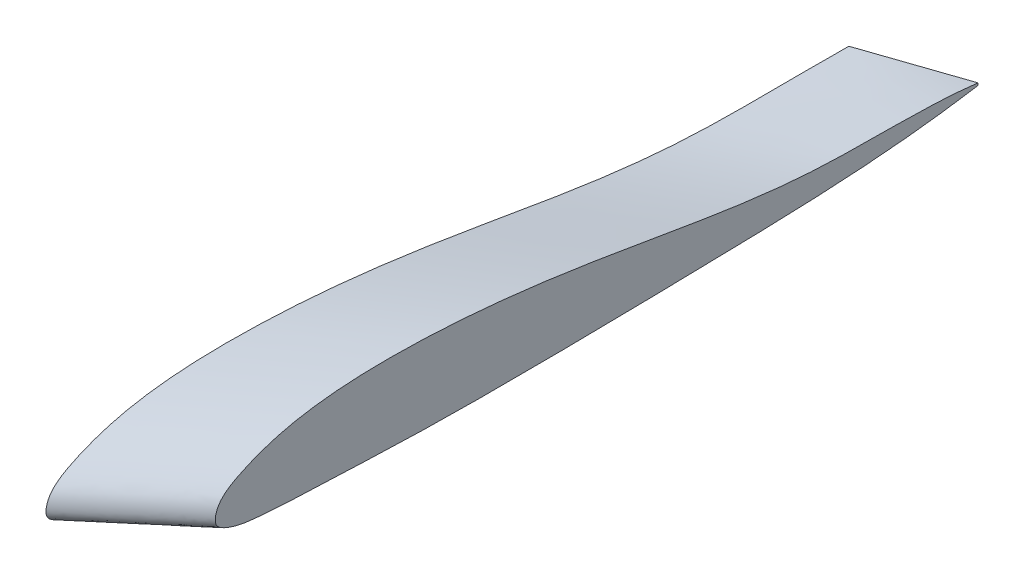
ISO-10303-21;
HEADER;
FILE_DESCRIPTION(('STEP AP214'),'2;1');
FILE_NAME('part.step','',(''),(''),'','','');
FILE_SCHEMA(('AUTOMOTIVE_DESIGN { 1 0 10303 214 1 1 1 1 }'));
ENDSEC;
DATA;
#1=APPLICATION_CONTEXT('core data for automotive mechanical design processes');
#2=APPLICATION_PROTOCOL_DEFINITION('international standard','automotive_design',2000,#1);
#3=PRODUCT_CONTEXT('',#1,'mechanical');
#4=PRODUCT('Part','Part','',(#3));
#5=PRODUCT_RELATED_PRODUCT_CATEGORY('part','',(#4));
#6=PRODUCT_DEFINITION_FORMATION('','',#4);
#7=PRODUCT_DEFINITION_CONTEXT('part definition',#1,'design');
#8=PRODUCT_DEFINITION('design','',#6,#7);
#9=PRODUCT_DEFINITION_SHAPE('','',#8);
#10=(LENGTH_UNIT() NAMED_UNIT(*) SI_UNIT(.MILLI.,.METRE.));
#11=(NAMED_UNIT(*) PLANE_ANGLE_UNIT() SI_UNIT($,.RADIAN.));
#12=(NAMED_UNIT(*) SI_UNIT($,.STERADIAN.) SOLID_ANGLE_UNIT());
#13=UNCERTAINTY_MEASURE_WITH_UNIT(LENGTH_MEASURE(1.E-05),#10,'distance_accuracy_value','');
#14=(GEOMETRIC_REPRESENTATION_CONTEXT(3) GLOBAL_UNCERTAINTY_ASSIGNED_CONTEXT((#13)) GLOBAL_UNIT_ASSIGNED_CONTEXT((#10,
#11,#12)) REPRESENTATION_CONTEXT('',''));
#15=CARTESIAN_POINT('',(0.,0.,0.));
#16=DIRECTION('',(0.,0.,1.));
#17=DIRECTION('',(1.,0.,0.));
#18=AXIS2_PLACEMENT_3D('',#15,#16,#17);
#19=CARTESIAN_POINT('',(119.,2.95740416741415,221.220776936864));
#20=DIRECTION('',(1.,0.,0.));
#21=DIRECTION('',(0.,0.,1.));
#22=AXIS2_PLACEMENT_3D('',#19,#20,#21);
#23=PLANE('',#22);
#24=CARTESIAN_POINT('',(119.,0.,-11.4352726787855));
#25=DIRECTION('',(0.,-1.,0.));
#26=VECTOR('',#25,1.);
#27=LINE('',#24,#26);
#28=CARTESIAN_POINT('',(119.,0.,-11.4352726787856));
#29=VERTEX_POINT('',#28);
#30=CARTESIAN_POINT('',(119.,-0.35,-11.4352726787856));
#31=VERTEX_POINT('',#30);
#32=EDGE_CURVE('E135',#29,#31,#27,.T.);
#33=ORIENTED_EDGE('',*,*,#32,.F.);
#34=CARTESIAN_POINT('',(119.,0.35,-11.4352726787856));
#35=DIRECTION('',(0.,-1.,0.));
#36=VECTOR('',#35,1.);
#37=LINE('',#34,#36);
#38=CARTESIAN_POINT('',(119.,0.35,-11.4352726787856));
#39=VERTEX_POINT('',#38);
#40=EDGE_CURVE('E11',#39,#29,#37,.T.);
#41=ORIENTED_EDGE('',*,*,#40,.F.);
#42=CARTESIAN_POINT('',(119.,-0.35,-11.4352726787856));
#43=CARTESIAN_POINT('',(119.,-1.16292682131921,-6.54825417721945));
#44=CARTESIAN_POINT('',(119.,-2.54015026831018,3.24705497371319));
#45=CARTESIAN_POINT('',(119.,-3.74964743756299,15.5336325624031));
#46=CARTESIAN_POINT('',(119.,-4.47575916054055,25.3820573807317));
#47=CARTESIAN_POINT('',(119.,-4.91603317596154,32.7763356123946));
#48=CARTESIAN_POINT('',(119.,-5.26843064397053,40.1769517062023));
#49=CARTESIAN_POINT('',(119.,-5.54936329104501,47.582376656798));
#50=CARTESIAN_POINT('',(119.,-5.77533721392469,54.9909514137634));
#51=CARTESIAN_POINT('',(119.,-5.96260791869112,62.4011284762026));
#52=CARTESIAN_POINT('',(119.,-6.12800637283226,69.8112668370009));
#53=CARTESIAN_POINT('',(119.,-6.28689407288055,77.2198654678917));
#54=CARTESIAN_POINT('',(119.,-6.43599251618654,84.6275550099858));
#55=CARTESIAN_POINT('',(119.,-6.57306171841232,92.0346997982751));
#56=CARTESIAN_POINT('',(119.,-6.69541413403284,99.4419971820227));
#57=CARTESIAN_POINT('',(119.,-6.80065427246404,106.849565689877));
#58=CARTESIAN_POINT('',(119.,-6.88610103266774,114.258641954144));
#59=CARTESIAN_POINT('',(119.,-6.94948203737368,121.66828295231));
#60=CARTESIAN_POINT('',(119.,-6.98779108738728,129.081647451455));
#61=CARTESIAN_POINT('',(119.,-6.99766931784512,135.259230724062));
#62=CARTESIAN_POINT('',(119.,-6.98655232413176,140.203542454516));
#63=CARTESIAN_POINT('',(119.,-6.96645767136293,143.909483118825));
#64=CARTESIAN_POINT('',(119.,-6.9331116112008,147.615030170778));
#65=CARTESIAN_POINT('',(119.,-6.88441942112307,151.318127625704));
#66=CARTESIAN_POINT('',(119.,-6.81889018497191,155.019150937513));
#67=CARTESIAN_POINT('',(119.,-6.73407591958183,158.716786717613));
#68=CARTESIAN_POINT('',(119.,-6.63054977241939,162.411858613324));
#69=CARTESIAN_POINT('',(119.,-6.51199337984942,166.106173110807));
#70=CARTESIAN_POINT('',(119.,-6.38114495877334,169.801437987743));
#71=CARTESIAN_POINT('',(119.,-6.24131194787134,173.499274889423));
#72=CARTESIAN_POINT('',(119.,-6.0952420442965,177.201547056997));
#73=CARTESIAN_POINT('',(119.,-5.94648778076816,180.909637308046));
#74=CARTESIAN_POINT('',(119.,-5.79718958592852,184.625815168445));
#75=CARTESIAN_POINT('',(119.,-5.65237655290013,188.350922073579));
#76=CARTESIAN_POINT('',(119.,-5.50698014936549,192.084957179379));
#77=CARTESIAN_POINT('',(119.,-5.37408180608309,195.188741955101));
#78=CARTESIAN_POINT('',(119.,-5.25515455095682,197.669594626395));
#79=CARTESIAN_POINT('',(119.,-5.15814471955948,199.523003676283));
#80=CARTESIAN_POINT('',(119.,-5.05181271820792,201.372430788576));
#81=CARTESIAN_POINT('',(119.,-4.93475970647772,203.214125784792));
#82=CARTESIAN_POINT('',(119.,-4.80536889729972,205.048379402763));
#83=CARTESIAN_POINT('',(119.,-4.66243621570701,206.873181284481));
#84=CARTESIAN_POINT('',(119.,-4.50390404612823,208.687970826163));
#85=CARTESIAN_POINT('',(119.,-4.32991077262588,210.490920025067));
#86=CARTESIAN_POINT('',(119.,-4.10301412733302,212.289534633203));
#87=CARTESIAN_POINT('',(119.,-3.83629389330219,213.791074806634));
#88=CARTESIAN_POINT('',(119.,-3.55688370082644,214.998195583526));
#89=CARTESIAN_POINT('',(119.,-3.30916911314403,215.906697331691));
#90=CARTESIAN_POINT('',(119.,-3.01873167667114,216.821253666854));
#91=CARTESIAN_POINT('',(119.,-2.67995110802381,217.738759242746));
#92=CARTESIAN_POINT('',(119.,-2.28945757563336,218.66919406818));
#93=CARTESIAN_POINT('',(119.,-1.83348935193824,219.571201925535));
#94=CARTESIAN_POINT('',(119.,-1.28855912826218,220.371527768933));
#95=CARTESIAN_POINT('',(119.,-0.747239143233636,220.905444768465));
#96=CARTESIAN_POINT('',(119.,-0.248032715813137,221.215387113392));
#97=CARTESIAN_POINT('',(119.,0.295458588175593,221.440251333546));
#98=CARTESIAN_POINT('',(119.,1.05820295604529,221.548777709212));
#99=CARTESIAN_POINT('',(119.,2.02790459594029,221.468831342982));
#100=CARTESIAN_POINT('',(119.,2.96915707854292,221.239430617679));
#101=CARTESIAN_POINT('',(119.,3.83880326773506,220.899076759452));
#102=CARTESIAN_POINT('',(119.,4.90656831172126,220.315118790194));
#103=CARTESIAN_POINT('',(119.,6.10695664706761,219.344046417132));
#104=CARTESIAN_POINT('',(119.,7.33291140349615,217.90604553752));
#105=CARTESIAN_POINT('',(119.,8.40317556934414,216.257282590438));
#106=CARTESIAN_POINT('',(119.,9.34056321429813,214.49073349921));
#107=CARTESIAN_POINT('',(119.,10.1920175229983,212.686868441499));
#108=CARTESIAN_POINT('',(119.,10.9770455214967,210.902309745545));
#109=CARTESIAN_POINT('',(119.,11.6971734342815,209.116781880944));
#110=CARTESIAN_POINT('',(119.,12.3552576596979,207.342192076731));
#111=CARTESIAN_POINT('',(119.,13.1580181788939,204.969963317302));
#112=CARTESIAN_POINT('',(119.,14.0213361315379,202.02399994383));
#113=CARTESIAN_POINT('',(119.,14.8708466793267,198.470183455636));
#114=CARTESIAN_POINT('',(119.,15.555737352218,194.907416651831));
#115=CARTESIAN_POINT('',(119.,16.1063741343338,191.312245280364));
#116=CARTESIAN_POINT('',(119.,16.5486327331011,187.679323357868));
#117=CARTESIAN_POINT('',(119.,16.8915892830335,184.012103056561));
#118=CARTESIAN_POINT('',(119.,17.1436068645942,180.318725299138));
#119=CARTESIAN_POINT('',(119.,17.3134592174667,176.604805727161));
#120=CARTESIAN_POINT('',(119.,17.4096506169164,172.877282879973));
#121=CARTESIAN_POINT('',(119.,17.440949766263,169.142481074109));
#122=CARTESIAN_POINT('',(119.,17.4157129177662,165.406791626082));
#123=CARTESIAN_POINT('',(119.,17.3431869224941,161.677292776569));
#124=CARTESIAN_POINT('',(119.,17.2260170977971,157.954505678734));
#125=CARTESIAN_POINT('',(119.,17.0656433162321,154.238156413117));
#126=CARTESIAN_POINT('',(119.,16.8638985325446,150.527489394968));
#127=CARTESIAN_POINT('',(119.,16.6225695143667,146.823396852572));
#128=CARTESIAN_POINT('',(119.,16.2500621389459,141.89005441367));
#129=CARTESIAN_POINT('',(119.,15.6943489059514,135.739613736921));
#130=CARTESIAN_POINT('',(119.,14.8963194093554,128.375126060822));
#131=CARTESIAN_POINT('',(119.,13.9817623339155,121.028940011622));
#132=CARTESIAN_POINT('',(119.,12.9637803922771,113.696645529462));
#133=CARTESIAN_POINT('',(119.,11.8574530032174,106.377169375441));
#134=CARTESIAN_POINT('',(119.,10.6742829641248,99.0681739477859));
#135=CARTESIAN_POINT('',(119.,9.43767024413907,91.7659109605359));
#136=CARTESIAN_POINT('',(119.,8.1850946990511,84.4627049172481));
#137=CARTESIAN_POINT('',(119.,6.94994692276625,77.1525986105458));
#138=CARTESIAN_POINT('',(119.,5.76728296829123,69.8279925948378));
#139=CARTESIAN_POINT('',(119.,4.67377193145514,62.4885145878055));
#140=CARTESIAN_POINT('',(119.,3.70708911389036,55.1344560699988));
#141=CARTESIAN_POINT('',(119.,3.03816783616175,48.9943315219133));
#142=CARTESIAN_POINT('',(119.,2.60388015903615,44.0750978154637));
#143=CARTESIAN_POINT('',(119.,2.33295589580388,40.3823071900516));
#144=CARTESIAN_POINT('',(119.,2.12233801900456,36.6860131934602));
#145=CARTESIAN_POINT('',(119.,1.92490486862087,31.7532318872213));
#146=CARTESIAN_POINT('',(119.,1.79992968404067,25.580543599042));
#147=CARTESIAN_POINT('',(119.,1.74389634421857,18.1677560989187));
#148=CARTESIAN_POINT('',(119.,1.67960462949464,10.7543770387837));
#149=CARTESIAN_POINT('',(119.,1.50534553464137,3.34550229648598));
#150=CARTESIAN_POINT('',(119.,1.11917798407249,-4.05382283175776));
#151=CARTESIAN_POINT('',(119.,0.652573153172295,-8.97697385608558));
#152=CARTESIAN_POINT('',(119.,0.35,-11.4352726787856));
#153=B_SPLINE_CURVE_WITH_KNOTS('',3,(#42,#43,#44,#45,#46,#47,#48,#49,#50,#51,#52,#53,#54,#55,
#56,#57,#58,#59,#60,#61,#62,#63,#64,#65,#66,#67,#68,#69,#70,#71,#72,#73,#74,#75,#76,#77,#78,#79,
#80,#81,#82,#83,#84,#85,#86,#87,#88,#89,#90,#91,#92,#93,#94,#95,#96,#97,#98,#99,#100,#101,#102,
#103,#104,#105,#106,#107,#108,#109,#110,#111,#112,#113,#114,#115,#116,#117,#118,#119,#120,#121,
#122,#123,#124,#125,#126,#127,#128,#129,#130,#131,#132,#133,#134,#135,#136,#137,#138,#139,#140,
#141,#142,#143,#144,#145,#146,#147,#148,#149,#150,#151,#152),.UNSPECIFIED.,.F.,.F.,(4,1,1,1,1,1,
1,1,1,1,1,1,1,1,1,1,1,1,1,1,1,1,1,1,1,1,1,1,1,1,1,1,1,1,1,1,1,1,1,1,1,1,1,1,1,1,1,1,1,1,1,1,1,1,
1,1,1,1,1,1,1,1,1,1,1,1,1,1,1,1,1,1,1,1,1,1,1,1,1,1,1,1,1,1,1,1,1,1,1,1,1,1,1,1,1,1,1,1,1,1,1,1,
1,1,1,1,1,1,4),(0.,0.03125,0.0625,0.078125,0.09375,0.109375,0.125,0.140625,0.15625,0.171875,
0.1875,0.203125,0.21875,0.234375,0.25,0.265625,0.28125,0.296875,0.3125,0.3203125,0.328125,
0.3359375,0.34375,0.3515625,0.359375,0.3671875,0.375,0.3828125,0.390625,0.3984375,0.40625,
0.4140625,0.421875,0.4296875,0.4375,0.44140625,0.4453125,0.44921875,0.453125,0.45703125,
0.4609375,0.46484375,0.46875,0.47265625,0.4765625,0.478515625,0.48046875,0.482421875,0.484375,
0.486328125,0.48828125,0.490234375,0.4921875,0.4931640625,0.494140625,0.49609375,0.498046875,
0.5,0.501953125,0.50390625,0.5078125,0.51171875,0.515625,0.51953125,0.5234375,0.52734375,
0.53125,0.53515625,0.5390625,0.546875,0.5546875,0.5625,0.5703125,0.578125,0.5859375,0.59375,
0.6015625,0.609375,0.6171875,0.625,0.6328125,0.640625,0.6484375,0.65625,0.6640625,0.671875,
0.6875,0.703125,0.71875,0.734375,0.75,0.765625,0.78125,0.796875,0.8125,0.828125,0.84375,
0.859375,0.875,0.8828125,0.890625,0.8984375,0.90625,0.921875,0.9375,0.953125,0.96875,0.984375,
1.),.UNSPECIFIED.);
#154=EDGE_CURVE('E55',#31,#39,#153,.T.);
#155=ORIENTED_EDGE('',*,*,#154,.F.);
#156=EDGE_LOOP('',(#33,#41,#155));
#157=FACE_BOUND('',#156,.T.);
#158=ADVANCED_FACE('F45',(#157),#23,.T.);
#159=CARTESIAN_POINT('',(91.,3.15645274886189,244.887348851406));
#160=DIRECTION('',(1.,0.,0.));
#161=DIRECTION('',(0.,0.,1.));
#162=AXIS2_PLACEMENT_3D('',#159,#160,#161);
#163=PLANE('',#162);
#164=CARTESIAN_POINT('',(91.,0.,0.));
#165=DIRECTION('',(0.,-1.,0.));
#166=VECTOR('',#165,1.);
#167=LINE('',#164,#166);
#168=CARTESIAN_POINT('',(91.,0.,0.));
#169=VERTEX_POINT('',#168);
#170=CARTESIAN_POINT('',(91.,-1.75,0.));
#171=VERTEX_POINT('',#170);
#172=EDGE_CURVE('E85',#169,#171,#167,.T.);
#173=ORIENTED_EDGE('',*,*,#172,.T.);
#174=CARTESIAN_POINT('',(91.,1.75,0.));
#175=CARTESIAN_POINT('',(91.,1.7892228041311,2.5950240734591));
#176=CARTESIAN_POINT('',(91.,1.8228881438157,7.78898361333505));
#177=CARTESIAN_POINT('',(91.0000000000001,1.79466523092205,15.5879199709359));
#178=CARTESIAN_POINT('',(90.9999999999999,1.74483688741246,23.3908828642898));
#179=CARTESIAN_POINT('',(91.0000000000001,1.72775107472437,31.1943484063972));
#180=CARTESIAN_POINT('',(90.9999999999999,1.80258864167514,38.9940374594705));
#181=CARTESIAN_POINT('',(91.,1.98391557716065,45.4880219087833));
#182=CARTESIAN_POINT('',(91.,2.23368748821817,50.6773433975115));
#183=CARTESIAN_POINT('',(91.,2.47590977237465,54.5661796243607));
#184=CARTESIAN_POINT('',(91.,2.77556357692326,58.4516391071774));
#185=CARTESIAN_POINT('',(91.,3.24450080399028,63.6276267645738));
#186=CARTESIAN_POINT('',(91.0000000000002,3.94733911560208,70.0887094975536));
#187=CARTESIAN_POINT('',(90.9999999999999,4.95205919959571,77.8275452787596));
#188=CARTESIAN_POINT('',(91.0000000000001,6.08393762321682,85.5511871576092));
#189=CARTESIAN_POINT('',(90.9999999999999,7.31376851464303,93.2590926278007));
#190=CARTESIAN_POINT('',(91.0000000000001,8.60881824050255,100.951423554088));
#191=CARTESIAN_POINT('',(90.9999999999999,9.92822919432248,108.636366466926));
#192=CARTESIAN_POINT('',(91.0000000000001,11.2342936435584,116.320170883715));
#193=CARTESIAN_POINT('',(91.,12.4833988349286,124.011104397752));
#194=CARTESIAN_POINT('',(91.,13.6498894844943,131.713119056533));
#195=CARTESIAN_POINT('',(91.,14.72220538652,139.428626657971));
#196=CARTESIAN_POINT('',(91.0000000000002,15.6846754531355,147.158830594996));
#197=CARTESIAN_POINT('',(90.9999999999998,16.5238438573529,154.908202795616));
#198=CARTESIAN_POINT('',(91.0000000000001,17.1077985590855,161.380240069004));
#199=CARTESIAN_POINT('',(90.9999999999999,17.4990708202994,166.57137304651));
#200=CARTESIAN_POINT('',(91.,17.7525003046351,170.469114137969));
#201=CARTESIAN_POINT('',(91.,17.9643216112168,174.373717194104));
#202=CARTESIAN_POINT('',(91.,18.1326932736828,178.284320006971));
#203=CARTESIAN_POINT('',(91.,18.2557252232259,182.201681199881));
#204=CARTESIAN_POINT('',(91.,18.3319318744783,186.126093453684));
#205=CARTESIAN_POINT('',(91.,18.3585934059721,190.057042610441));
#206=CARTESIAN_POINT('',(91.0000000000001,18.3259788124368,193.98709402273));
#207=CARTESIAN_POINT('',(90.9999999999999,18.2252499410417,197.909546466613));
#208=CARTESIAN_POINT('',(91.,18.0471806376733,201.817711741266));
#209=CARTESIAN_POINT('',(91.,17.782773352231,205.704353527307));
#210=CARTESIAN_POINT('',(91.0000000000001,17.422811463154,209.563468412418));
#211=CARTESIAN_POINT('',(91.,16.9584003446993,213.386679394118));
#212=CARTESIAN_POINT('',(91.,16.3801314815691,217.169982167914));
#213=CARTESIAN_POINT('',(91.0000000000001,15.660798875482,220.919422745089));
#214=CARTESIAN_POINT('',(90.9999999999998,14.7686974496789,224.658661773481));
#215=CARTESIAN_POINT('',(91.0000000000001,13.8617441256457,227.759297615653));
#216=CARTESIAN_POINT('',(91.,13.0187036319607,230.254915771287));
#217=CARTESIAN_POINT('',(90.9999999999999,12.3274037547326,232.122417324951));
#218=CARTESIAN_POINT('',(91.0000000000001,11.5709708117615,234.001030386043));
#219=CARTESIAN_POINT('',(90.9999999999999,10.7463765512962,235.878827142893));
#220=CARTESIAN_POINT('',(91.0000000000001,9.85186969298196,237.776613872829));
#221=CARTESIAN_POINT('',(90.9999999999999,8.86801146218415,239.637541945175));
#222=CARTESIAN_POINT('',(91.0000000000001,7.74505442558057,241.375774779754));
#223=CARTESIAN_POINT('',(90.9999999999999,6.4593464443183,242.895016893924));
#224=CARTESIAN_POINT('',(91.0000000000001,5.20026583886435,243.922798097));
#225=CARTESIAN_POINT('',(91.,4.08068757178192,244.543917918054));
#226=CARTESIAN_POINT('',(91.,3.16903722350211,244.90652413178));
#227=CARTESIAN_POINT('',(91.,2.18167671528422,245.153925131614));
#228=CARTESIAN_POINT('',(90.9999999999999,1.16060588862097,245.247336983675));
#229=CARTESIAN_POINT('',(91.,0.354518212513341,245.141546466597));
#230=CARTESIAN_POINT('',(91.,-0.223134434934372,244.91624478631));
#231=CARTESIAN_POINT('',(91.,-0.751156014824701,244.59588836971));
#232=CARTESIAN_POINT('',(90.9999999999999,-1.32724204769331,244.044229374878));
#233=CARTESIAN_POINT('',(91.0000000000003,-1.90447252025438,243.207492572718));
#234=CARTESIAN_POINT('',(90.9999999999997,-2.38886337561284,242.262517662733));
#235=CARTESIAN_POINT('',(91.0000000000002,-2.80221137289178,241.282815461145));
#236=CARTESIAN_POINT('',(91.,-3.16151662325105,240.317153892826));
#237=CARTESIAN_POINT('',(90.9999999999999,-3.46934917268773,239.354481563286));
#238=CARTESIAN_POINT('',(91.0000000000001,-3.73219880441634,238.398234753115));
#239=CARTESIAN_POINT('',(91.,-4.02865440976913,237.127929589368));
#240=CARTESIAN_POINT('',(91.,-4.31183768329607,235.547516585743));
#241=CARTESIAN_POINT('',(91.,-4.55258270996958,233.655119797629));
#242=CARTESIAN_POINT('',(91.,-4.73649431657501,231.757900417198));
#243=CARTESIAN_POINT('',(91.,-4.90360263292959,229.849008237555));
#244=CARTESIAN_POINT('',(91.,-5.05446015604199,227.92834896813));
#245=CARTESIAN_POINT('',(91.,-5.19088294503031,225.999731599442));
#246=CARTESIAN_POINT('',(91.,-5.31445094966296,224.059730950455));
#247=CARTESIAN_POINT('',(91.,-5.42648051549949,222.117430213744));
#248=CARTESIAN_POINT('',(91.,-5.5288136687208,220.165092091896));
#249=CARTESIAN_POINT('',(91.0000000000001,-5.65430732191332,217.554571923454));
#250=CARTESIAN_POINT('',(90.9999999999999,-5.7943508533075,214.28875515333));
#251=CARTESIAN_POINT('',(91.,-5.94756051901532,210.359644509207));
#252=CARTESIAN_POINT('',(90.9999999999999,-6.10000190886557,206.439551302544));
#253=CARTESIAN_POINT('',(91.0000000000001,-6.2573158844756,202.529009151615));
#254=CARTESIAN_POINT('',(91.,-6.41411578711327,198.626926302606));
#255=CARTESIAN_POINT('',(91.,-6.56812129252451,194.731034421703));
#256=CARTESIAN_POINT('',(91.,-6.7155343474968,190.839822881273));
#257=CARTESIAN_POINT('',(91.,-6.85342402019545,186.951370938727));
#258=CARTESIAN_POINT('',(91.,-6.9782525354215,183.063958190297));
#259=CARTESIAN_POINT('',(91.,-7.08710144036414,179.17580411536));
#260=CARTESIAN_POINT('',(90.9999999999999,-7.17603594531835,175.285019087026));
#261=CARTESIAN_POINT('',(91.0000000000002,-7.24439951435696,171.390662937399));
#262=CARTESIAN_POINT('',(90.9999999999998,-7.29506800334419,167.494177144313));
#263=CARTESIAN_POINT('',(91.0000000000001,-7.32974865365781,163.594954244268));
#264=CARTESIAN_POINT('',(91.,-7.35093294899561,159.695405610835));
#265=CARTESIAN_POINT('',(91.,-7.36344679233154,154.492509038975));
#266=CARTESIAN_POINT('',(91.,-7.35631335679185,147.991833118727));
#267=CARTESIAN_POINT('',(91.,-7.32445061353816,140.190068661385));
#268=CARTESIAN_POINT('',(91.,-7.26824356456548,132.392180799836));
#269=CARTESIAN_POINT('',(91.,-7.18883074299175,124.594798580806));
#270=CARTESIAN_POINT('',(91.,-7.0863804244436,116.799280916875));
#271=CARTESIAN_POINT('',(91.,-6.961574125786,109.004408032273));
#272=CARTESIAN_POINT('',(91.0000000000002,-6.81478455450544,101.210351518816));
#273=CARTESIAN_POINT('',(90.9999999999998,-6.6466222324991,93.4165273245399));
#274=CARTESIAN_POINT('',(91.0000000000001,-6.45742390900775,85.622776094488));
#275=CARTESIAN_POINT('',(91.0000000000001,-6.24802937556835,77.8286606578364));
#276=CARTESIAN_POINT('',(90.9999999999999,-6.01294185834498,70.0347667877218));
#277=CARTESIAN_POINT('',(91.0000000000001,-5.74612347664887,62.2416906711169));
#278=CARTESIAN_POINT('',(90.9999999999999,-5.44175529574849,54.4500472548978));
#279=CARTESIAN_POINT('',(91.0000000000001,-5.09390682810369,46.6604153590439));
#280=CARTESIAN_POINT('',(90.9999999999999,-4.69670834908571,38.8734391705832));
#281=CARTESIAN_POINT('',(91.,-4.09343637256093,28.4950534035661));
#282=CARTESIAN_POINT('',(91.,-3.18650027728009,15.5317388218755));
#283=CARTESIAN_POINT('',(91.,-2.26648096621491,5.17446649286917));
#284=CARTESIAN_POINT('',(91.,-1.75,0.));
#285=B_SPLINE_CURVE_WITH_KNOTS('',3,(#174,#175,#176,#177,#178,#179,#180,#181,#182,#183,#184,
#185,#186,#187,#188,#189,#190,#191,#192,#193,#194,#195,#196,#197,#198,#199,#200,#201,#202,#203,
#204,#205,#206,#207,#208,#209,#210,#211,#212,#213,#214,#215,#216,#217,#218,#219,#220,#221,#222,
#223,#224,#225,#226,#227,#228,#229,#230,#231,#232,#233,#234,#235,#236,#237,#238,#239,#240,#241,
#242,#243,#244,#245,#246,#247,#248,#249,#250,#251,#252,#253,#254,#255,#256,#257,#258,#259,#260,
#261,#262,#263,#264,#265,#266,#267,#268,#269,#270,#271,#272,#273,#274,#275,#276,#277,#278,#279,
#280,#281,#282,#283,#284),.UNSPECIFIED.,.F.,.F.,(4,1,1,1,1,1,1,1,1,1,1,1,1,1,1,1,1,1,1,1,1,1,1,
1,1,1,1,1,1,1,1,1,1,1,1,1,1,1,1,1,1,1,1,1,1,1,1,1,1,1,1,1,1,1,1,1,1,1,1,1,1,1,1,1,1,1,1,1,1,1,1,
1,1,1,1,1,1,1,1,1,1,1,1,1,1,1,1,1,1,1,1,1,1,1,1,1,1,1,1,1,1,1,1,1,1,1,1,1,4),(0.,0.015625,
0.03125,0.046875,0.0625,0.078125,0.09375,0.1015625,0.109375,0.1171875,0.125,0.140625,0.15625,
0.171875,0.1875,0.203125,0.21875,0.234375,0.25,0.265625,0.28125,0.296875,0.3125,0.328125,
0.3359375,0.34375,0.3515625,0.359375,0.3671875,0.375,0.3828125,0.390625,0.3984375,0.40625,
0.4140625,0.421875,0.4296875,0.4375,0.4453125,0.453125,0.4609375,0.46484375,0.46875,0.47265625,
0.4765625,0.48046875,0.484375,0.48828125,0.4921875,0.49609375,0.498046875,0.5,0.501953125,
0.50390625,0.505859375,0.5068359375,0.5078125,0.509765625,0.51171875,0.513671875,0.515625,
0.517578125,0.51953125,0.521484375,0.5234375,0.52734375,0.53125,0.53515625,0.5390625,0.54296875,
0.546875,0.55078125,0.5546875,0.55859375,0.5625,0.5703125,0.578125,0.5859375,0.59375,0.6015625,
0.609375,0.6171875,0.625,0.6328125,0.640625,0.6484375,0.65625,0.6640625,0.671875,0.6796875,
0.6875,0.703125,0.71875,0.734375,0.75,0.765625,0.78125,0.796875,0.8125,0.828125,0.84375,
0.859375,0.875,0.890625,0.90625,0.921875,0.9375,0.96875,1.),.UNSPECIFIED.);
#286=CARTESIAN_POINT('',(91.,1.75,0.));
#287=VERTEX_POINT('',#286);
#288=EDGE_CURVE('E88',#171,#287,#285,.F.);
#289=ORIENTED_EDGE('',*,*,#288,.T.);
#290=CARTESIAN_POINT('',(91.,1.75,0.));
#291=DIRECTION('',(0.,-1.,0.));
#292=VECTOR('',#291,1.);
#293=LINE('',#290,#292);
#294=EDGE_CURVE('E81',#287,#169,#293,.T.);
#295=ORIENTED_EDGE('',*,*,#294,.T.);
#296=EDGE_LOOP('',(#173,#289,#295));
#297=FACE_BOUND('',#296,.T.);
#298=ADVANCED_FACE('F84',(#297),#163,.F.);
#299=CARTESIAN_POINT('',(91.,1.75,0.));
#300=DIRECTION('',(-0.378086913544499,0.,-0.925770104186992));
#301=DIRECTION('',(0.,-1.,0.));
#302=AXIS2_PLACEMENT_3D('',#299,#300,#301);
#303=PLANE('',#302);
#304=ORIENTED_EDGE('',*,*,#294,.F.);
#305=DIRECTION('',(-0.924779905706245,0.0462389952853123,0.377682513914733));
#306=VECTOR('',#305,1.);
#307=CARTESIAN_POINT('',(105.,1.05,-5.71763633939278));
#308=LINE('',#307,#306);
#309=EDGE_CURVE('E66',#39,#287,#308,.T.);
#310=ORIENTED_EDGE('',*,*,#309,.F.);
#311=ORIENTED_EDGE('',*,*,#40,.T.);
#312=ORIENTED_EDGE('',*,*,#32,.T.);
#313=DIRECTION('',(0.924779905706245,0.0462389952853123,-0.377682513914733));
#314=VECTOR('',#313,1.);
#315=CARTESIAN_POINT('',(105.,-1.05,-5.71763633939278));
#316=LINE('',#315,#314);
#317=EDGE_CURVE('E95',#171,#31,#316,.T.);
#318=ORIENTED_EDGE('',*,*,#317,.F.);
#319=ORIENTED_EDGE('',*,*,#172,.F.);
#320=EDGE_LOOP('',(#304,#310,#311,#312,#318,#319));
#321=FACE_BOUND('',#320,.T.);
#322=ADVANCED_FACE('F94',(#321),#303,.T.);
#323=CARTESIAN_POINT('',(91.,-1.75,0.));
#324=CARTESIAN_POINT('',(119.,-0.35,-11.4352726787856));
#325=CARTESIAN_POINT('',(91.,-2.26648096621491,5.17446649286917));
#326=CARTESIAN_POINT('',(119.,-1.16292682131921,-6.54825417721945));
#327=CARTESIAN_POINT('',(91.,-3.18650027728009,15.5317388218755));
#328=CARTESIAN_POINT('',(119.,-2.54015026831018,3.24705497371319));
#329=CARTESIAN_POINT('',(91.,-4.09343637256093,28.4950534035661));
#330=CARTESIAN_POINT('',(119.,-3.74964743756299,15.5336325624031));
#331=CARTESIAN_POINT('',(90.9999999999999,-4.69670834908571,38.8734391705832));
#332=CARTESIAN_POINT('',(119.,-4.47575916054055,25.3820573807317));
#333=CARTESIAN_POINT('',(91.0000000000001,-5.09390682810369,46.6604153590439));
#334=CARTESIAN_POINT('',(119.,-4.91603317596154,32.7763356123946));
#335=CARTESIAN_POINT('',(90.9999999999999,-5.44175529574849,54.4500472548978));
#336=CARTESIAN_POINT('',(119.,-5.26843064397053,40.1769517062023));
#337=CARTESIAN_POINT('',(91.0000000000001,-5.74612347664887,62.2416906711169));
#338=CARTESIAN_POINT('',(119.,-5.54936329104501,47.582376656798));
#339=CARTESIAN_POINT('',(90.9999999999999,-6.01294185834498,70.0347667877218));
#340=CARTESIAN_POINT('',(119.,-5.77533721392469,54.9909514137634));
#341=CARTESIAN_POINT('',(91.0000000000001,-6.24802937556835,77.8286606578364));
#342=CARTESIAN_POINT('',(119.,-5.96260791869112,62.4011284762026));
#343=CARTESIAN_POINT('',(91.0000000000001,-6.45742390900775,85.622776094488));
#344=CARTESIAN_POINT('',(119.,-6.12800637283226,69.8112668370009));
#345=CARTESIAN_POINT('',(90.9999999999998,-6.6466222324991,93.4165273245399));
#346=CARTESIAN_POINT('',(119.,-6.28689407288055,77.2198654678917));
#347=CARTESIAN_POINT('',(91.0000000000002,-6.81478455450544,101.210351518816));
#348=CARTESIAN_POINT('',(119.,-6.43599251618654,84.6275550099858));
#349=CARTESIAN_POINT('',(91.,-6.961574125786,109.004408032273));
#350=CARTESIAN_POINT('',(119.,-6.57306171841232,92.0346997982751));
#351=CARTESIAN_POINT('',(91.,-7.0863804244436,116.799280916875));
#352=CARTESIAN_POINT('',(119.,-6.69541413403284,99.4419971820227));
#353=CARTESIAN_POINT('',(91.,-7.18883074299175,124.594798580806));
#354=CARTESIAN_POINT('',(119.,-6.80065427246404,106.849565689877));
#355=CARTESIAN_POINT('',(91.,-7.26824356456548,132.392180799836));
#356=CARTESIAN_POINT('',(119.,-6.88610103266774,114.258641954144));
#357=CARTESIAN_POINT('',(91.,-7.32445061353816,140.190068661385));
#358=CARTESIAN_POINT('',(119.,-6.94948203737368,121.66828295231));
#359=CARTESIAN_POINT('',(91.,-7.35631335679185,147.991833118727));
#360=CARTESIAN_POINT('',(119.,-6.98779108738728,129.081647451455));
#361=CARTESIAN_POINT('',(91.,-7.36344679233154,154.492509038975));
#362=CARTESIAN_POINT('',(119.,-6.99766931784512,135.259230724062));
#363=CARTESIAN_POINT('',(91.,-7.35093294899561,159.695405610835));
#364=CARTESIAN_POINT('',(119.,-6.98655232413176,140.203542454516));
#365=CARTESIAN_POINT('',(91.0000000000001,-7.32974865365781,163.594954244268));
#366=CARTESIAN_POINT('',(119.,-6.96645767136293,143.909483118825));
#367=CARTESIAN_POINT('',(90.9999999999998,-7.29506800334419,167.494177144313));
#368=CARTESIAN_POINT('',(119.,-6.9331116112008,147.615030170778));
#369=CARTESIAN_POINT('',(91.0000000000002,-7.24439951435696,171.390662937399));
#370=CARTESIAN_POINT('',(119.,-6.88441942112307,151.318127625704));
#371=CARTESIAN_POINT('',(90.9999999999999,-7.17603594531835,175.285019087026));
#372=CARTESIAN_POINT('',(119.,-6.81889018497191,155.019150937513));
#373=CARTESIAN_POINT('',(91.,-7.08710144036414,179.17580411536));
#374=CARTESIAN_POINT('',(119.,-6.73407591958183,158.716786717613));
#375=CARTESIAN_POINT('',(91.,-6.9782525354215,183.063958190297));
#376=CARTESIAN_POINT('',(119.,-6.63054977241939,162.411858613324));
#377=CARTESIAN_POINT('',(91.,-6.85342402019545,186.951370938727));
#378=CARTESIAN_POINT('',(119.,-6.51199337984942,166.106173110807));
#379=CARTESIAN_POINT('',(91.,-6.7155343474968,190.839822881273));
#380=CARTESIAN_POINT('',(119.,-6.38114495877334,169.801437987743));
#381=CARTESIAN_POINT('',(91.,-6.56812129252451,194.731034421703));
#382=CARTESIAN_POINT('',(119.,-6.24131194787134,173.499274889423));
#383=CARTESIAN_POINT('',(91.,-6.41411578711327,198.626926302606));
#384=CARTESIAN_POINT('',(119.,-6.0952420442965,177.201547056997));
#385=CARTESIAN_POINT('',(91.0000000000001,-6.2573158844756,202.529009151615));
#386=CARTESIAN_POINT('',(119.,-5.94648778076816,180.909637308046));
#387=CARTESIAN_POINT('',(90.9999999999999,-6.10000190886557,206.439551302544));
#388=CARTESIAN_POINT('',(119.,-5.79718958592852,184.625815168445));
#389=CARTESIAN_POINT('',(91.,-5.94756051901532,210.359644509207));
#390=CARTESIAN_POINT('',(119.,-5.65237655290013,188.350922073579));
#391=CARTESIAN_POINT('',(90.9999999999999,-5.7943508533075,214.28875515333));
#392=CARTESIAN_POINT('',(119.,-5.50698014936549,192.084957179379));
#393=CARTESIAN_POINT('',(91.0000000000001,-5.65430732191332,217.554571923454));
#394=CARTESIAN_POINT('',(119.,-5.37408180608309,195.188741955101));
#395=CARTESIAN_POINT('',(91.,-5.5288136687208,220.165092091896));
#396=CARTESIAN_POINT('',(119.,-5.25515455095682,197.669594626395));
#397=CARTESIAN_POINT('',(91.,-5.42648051549949,222.117430213744));
#398=CARTESIAN_POINT('',(119.,-5.15814471955948,199.523003676283));
#399=CARTESIAN_POINT('',(91.,-5.31445094966296,224.059730950455));
#400=CARTESIAN_POINT('',(119.,-5.05181271820792,201.372430788576));
#401=CARTESIAN_POINT('',(91.,-5.19088294503031,225.999731599442));
#402=CARTESIAN_POINT('',(119.,-4.93475970647772,203.214125784792));
#403=CARTESIAN_POINT('',(91.,-5.05446015604199,227.92834896813));
#404=CARTESIAN_POINT('',(119.,-4.80536889729972,205.048379402763));
#405=CARTESIAN_POINT('',(91.,-4.90360263292959,229.849008237555));
#406=CARTESIAN_POINT('',(119.,-4.66243621570701,206.873181284481));
#407=CARTESIAN_POINT('',(91.,-4.73649431657501,231.757900417198));
#408=CARTESIAN_POINT('',(119.,-4.50390404612823,208.687970826163));
#409=CARTESIAN_POINT('',(91.,-4.55258270996958,233.655119797629));
#410=CARTESIAN_POINT('',(119.,-4.32991077262588,210.490920025067));
#411=CARTESIAN_POINT('',(91.,-4.31183768329607,235.547516585743));
#412=CARTESIAN_POINT('',(119.,-4.10301412733302,212.289534633203));
#413=CARTESIAN_POINT('',(91.,-4.02865440976913,237.127929589368));
#414=CARTESIAN_POINT('',(119.,-3.83629389330219,213.791074806634));
#415=CARTESIAN_POINT('',(91.0000000000001,-3.73219880441634,238.398234753115));
#416=CARTESIAN_POINT('',(119.,-3.55688370082644,214.998195583526));
#417=CARTESIAN_POINT('',(90.9999999999999,-3.46934917268773,239.354481563286));
#418=CARTESIAN_POINT('',(119.,-3.30916911314403,215.906697331691));
#419=CARTESIAN_POINT('',(91.,-3.16151662325105,240.317153892826));
#420=CARTESIAN_POINT('',(119.,-3.01873167667114,216.821253666854));
#421=CARTESIAN_POINT('',(91.0000000000002,-2.80221137289178,241.282815461145));
#422=CARTESIAN_POINT('',(119.,-2.67995110802381,217.738759242746));
#423=CARTESIAN_POINT('',(90.9999999999997,-2.38886337561284,242.262517662733));
#424=CARTESIAN_POINT('',(119.,-2.28945757563336,218.66919406818));
#425=CARTESIAN_POINT('',(91.0000000000003,-1.90447252025438,243.207492572718));
#426=CARTESIAN_POINT('',(119.,-1.83348935193824,219.571201925535));
#427=CARTESIAN_POINT('',(90.9999999999999,-1.32724204769331,244.044229374878));
#428=CARTESIAN_POINT('',(119.,-1.28855912826218,220.371527768933));
#429=CARTESIAN_POINT('',(91.,-0.751156014824701,244.59588836971));
#430=CARTESIAN_POINT('',(119.,-0.747239143233636,220.905444768465));
#431=CARTESIAN_POINT('',(91.,-0.223134434934372,244.91624478631));
#432=CARTESIAN_POINT('',(119.,-0.248032715813137,221.215387113392));
#433=CARTESIAN_POINT('',(91.,0.354518212513341,245.141546466597));
#434=CARTESIAN_POINT('',(119.,0.295458588175593,221.440251333546));
#435=CARTESIAN_POINT('',(90.9999999999999,1.16060588862097,245.247336983675));
#436=CARTESIAN_POINT('',(119.,1.05820295604529,221.548777709212));
#437=CARTESIAN_POINT('',(91.,2.18167671528422,245.153925131614));
#438=CARTESIAN_POINT('',(119.,2.02790459594029,221.468831342982));
#439=CARTESIAN_POINT('',(91.,3.16903722350211,244.90652413178));
#440=CARTESIAN_POINT('',(119.,2.96915707854292,221.239430617679));
#441=CARTESIAN_POINT('',(91.,4.08068757178192,244.543917918054));
#442=CARTESIAN_POINT('',(119.,3.83880326773506,220.899076759452));
#443=CARTESIAN_POINT('',(91.0000000000001,5.20026583886435,243.922798097));
#444=CARTESIAN_POINT('',(119.,4.90656831172126,220.315118790194));
#445=CARTESIAN_POINT('',(90.9999999999999,6.4593464443183,242.895016893924));
#446=CARTESIAN_POINT('',(119.,6.10695664706761,219.344046417132));
#447=CARTESIAN_POINT('',(91.0000000000001,7.74505442558057,241.375774779754));
#448=CARTESIAN_POINT('',(119.,7.33291140349615,217.90604553752));
#449=CARTESIAN_POINT('',(90.9999999999999,8.86801146218415,239.637541945175));
#450=CARTESIAN_POINT('',(119.,8.40317556934414,216.257282590438));
#451=CARTESIAN_POINT('',(91.0000000000001,9.85186969298196,237.776613872829));
#452=CARTESIAN_POINT('',(119.,9.34056321429813,214.49073349921));
#453=CARTESIAN_POINT('',(90.9999999999999,10.7463765512962,235.878827142893));
#454=CARTESIAN_POINT('',(119.,10.1920175229983,212.686868441499));
#455=CARTESIAN_POINT('',(91.0000000000001,11.5709708117615,234.001030386043));
#456=CARTESIAN_POINT('',(119.,10.9770455214967,210.902309745545));
#457=CARTESIAN_POINT('',(90.9999999999999,12.3274037547326,232.122417324951));
#458=CARTESIAN_POINT('',(119.,11.6971734342815,209.116781880944));
#459=CARTESIAN_POINT('',(91.,13.0187036319607,230.254915771287));
#460=CARTESIAN_POINT('',(119.,12.3552576596979,207.342192076731));
#461=CARTESIAN_POINT('',(91.0000000000001,13.8617441256457,227.759297615653));
#462=CARTESIAN_POINT('',(119.,13.1580181788939,204.969963317302));
#463=CARTESIAN_POINT('',(90.9999999999998,14.7686974496789,224.658661773481));
#464=CARTESIAN_POINT('',(119.,14.0213361315379,202.02399994383));
#465=CARTESIAN_POINT('',(91.0000000000001,15.660798875482,220.919422745089));
#466=CARTESIAN_POINT('',(119.,14.8708466793267,198.470183455636));
#467=CARTESIAN_POINT('',(91.,16.3801314815691,217.169982167914));
#468=CARTESIAN_POINT('',(119.,15.555737352218,194.907416651831));
#469=CARTESIAN_POINT('',(91.,16.9584003446993,213.386679394118));
#470=CARTESIAN_POINT('',(119.,16.1063741343338,191.312245280364));
#471=CARTESIAN_POINT('',(91.0000000000001,17.422811463154,209.563468412418));
#472=CARTESIAN_POINT('',(119.,16.5486327331011,187.679323357868));
#473=CARTESIAN_POINT('',(91.,17.782773352231,205.704353527307));
#474=CARTESIAN_POINT('',(119.,16.8915892830335,184.012103056561));
#475=CARTESIAN_POINT('',(91.,18.0471806376733,201.817711741266));
#476=CARTESIAN_POINT('',(119.,17.1436068645942,180.318725299138));
#477=CARTESIAN_POINT('',(90.9999999999999,18.2252499410417,197.909546466613));
#478=CARTESIAN_POINT('',(119.,17.3134592174667,176.604805727161));
#479=CARTESIAN_POINT('',(91.0000000000001,18.3259788124368,193.98709402273));
#480=CARTESIAN_POINT('',(119.,17.4096506169164,172.877282879973));
#481=CARTESIAN_POINT('',(91.,18.3585934059721,190.057042610441));
#482=CARTESIAN_POINT('',(119.,17.440949766263,169.142481074109));
#483=CARTESIAN_POINT('',(91.,18.3319318744783,186.126093453684));
#484=CARTESIAN_POINT('',(119.,17.4157129177662,165.406791626082));
#485=CARTESIAN_POINT('',(91.,18.2557252232259,182.201681199881));
#486=CARTESIAN_POINT('',(119.,17.3431869224941,161.677292776569));
#487=CARTESIAN_POINT('',(91.,18.1326932736828,178.284320006971));
#488=CARTESIAN_POINT('',(119.,17.2260170977971,157.954505678734));
#489=CARTESIAN_POINT('',(91.,17.9643216112168,174.373717194104));
#490=CARTESIAN_POINT('',(119.,17.0656433162321,154.238156413117));
#491=CARTESIAN_POINT('',(91.,17.7525003046351,170.469114137969));
#492=CARTESIAN_POINT('',(119.,16.8638985325446,150.527489394968));
#493=CARTESIAN_POINT('',(90.9999999999999,17.4990708202994,166.57137304651));
#494=CARTESIAN_POINT('',(119.,16.6225695143667,146.823396852572));
#495=CARTESIAN_POINT('',(91.0000000000001,17.1077985590855,161.380240069004));
#496=CARTESIAN_POINT('',(119.,16.2500621389459,141.89005441367));
#497=CARTESIAN_POINT('',(90.9999999999998,16.5238438573529,154.908202795616));
#498=CARTESIAN_POINT('',(119.,15.6943489059514,135.739613736921));
#499=CARTESIAN_POINT('',(91.0000000000002,15.6846754531355,147.158830594996));
#500=CARTESIAN_POINT('',(119.,14.8963194093554,128.375126060822));
#501=CARTESIAN_POINT('',(91.,14.72220538652,139.428626657971));
#502=CARTESIAN_POINT('',(119.,13.9817623339155,121.028940011622));
#503=CARTESIAN_POINT('',(91.,13.6498894844943,131.713119056533));
#504=CARTESIAN_POINT('',(119.,12.9637803922771,113.696645529462));
#505=CARTESIAN_POINT('',(91.,12.4833988349286,124.011104397752));
#506=CARTESIAN_POINT('',(119.,11.8574530032174,106.377169375441));
#507=CARTESIAN_POINT('',(91.0000000000001,11.2342936435584,116.320170883715));
#508=CARTESIAN_POINT('',(119.,10.6742829641248,99.0681739477859));
#509=CARTESIAN_POINT('',(90.9999999999999,9.92822919432248,108.636366466926));
#510=CARTESIAN_POINT('',(119.,9.43767024413907,91.7659109605359));
#511=CARTESIAN_POINT('',(91.0000000000001,8.60881824050255,100.951423554088));
#512=CARTESIAN_POINT('',(119.,8.1850946990511,84.4627049172481));
#513=CARTESIAN_POINT('',(90.9999999999999,7.31376851464303,93.2590926278007));
#514=CARTESIAN_POINT('',(119.,6.94994692276625,77.1525986105458));
#515=CARTESIAN_POINT('',(91.0000000000001,6.08393762321682,85.5511871576092));
#516=CARTESIAN_POINT('',(119.,5.76728296829123,69.8279925948378));
#517=CARTESIAN_POINT('',(90.9999999999999,4.95205919959571,77.8275452787596));
#518=CARTESIAN_POINT('',(119.,4.67377193145514,62.4885145878055));
#519=CARTESIAN_POINT('',(91.0000000000002,3.94733911560208,70.0887094975536));
#520=CARTESIAN_POINT('',(119.,3.70708911389036,55.1344560699988));
#521=CARTESIAN_POINT('',(91.,3.24450080399028,63.6276267645738));
#522=CARTESIAN_POINT('',(119.,3.03816783616175,48.9943315219133));
#523=CARTESIAN_POINT('',(91.,2.77556357692326,58.4516391071774));
#524=CARTESIAN_POINT('',(119.,2.60388015903615,44.0750978154637));
#525=CARTESIAN_POINT('',(91.,2.47590977237465,54.5661796243607));
#526=CARTESIAN_POINT('',(119.,2.33295589580388,40.3823071900516));
#527=CARTESIAN_POINT('',(91.,2.23368748821817,50.6773433975115));
#528=CARTESIAN_POINT('',(119.,2.12233801900456,36.6860131934602));
#529=CARTESIAN_POINT('',(91.,1.98391557716065,45.4880219087833));
#530=CARTESIAN_POINT('',(119.,1.92490486862087,31.7532318872213));
#531=CARTESIAN_POINT('',(90.9999999999999,1.80258864167514,38.9940374594705));
#532=CARTESIAN_POINT('',(119.,1.79992968404067,25.580543599042));
#533=CARTESIAN_POINT('',(91.0000000000001,1.72775107472437,31.1943484063972));
#534=CARTESIAN_POINT('',(119.,1.74389634421857,18.1677560989187));
#535=CARTESIAN_POINT('',(90.9999999999999,1.74483688741246,23.3908828642898));
#536=CARTESIAN_POINT('',(119.,1.67960462949464,10.7543770387837));
#537=CARTESIAN_POINT('',(91.0000000000001,1.79466523092205,15.5879199709359));
#538=CARTESIAN_POINT('',(119.,1.50534553464137,3.34550229648598));
#539=CARTESIAN_POINT('',(91.,1.8228881438157,7.78898361333505));
#540=CARTESIAN_POINT('',(119.,1.11917798407249,-4.05382283175776));
#541=CARTESIAN_POINT('',(91.,1.7892228041311,2.5950240734591));
#542=CARTESIAN_POINT('',(119.,0.652573153172295,-8.97697385608558));
#543=CARTESIAN_POINT('',(91.,1.75,0.));
#544=CARTESIAN_POINT('',(119.,0.35,-11.4352726787856));
#545=B_SPLINE_SURFACE_WITH_KNOTS('',3,1,((#323,#324),(#325,#326),(#327,#328),(#329,#330),(#331,
#332),(#333,#334),(#335,#336),(#337,#338),(#339,#340),(#341,#342),(#343,#344),(#345,#346),(#347,
#348),(#349,#350),(#351,#352),(#353,#354),(#355,#356),(#357,#358),(#359,#360),(#361,#362),(#363,
#364),(#365,#366),(#367,#368),(#369,#370),(#371,#372),(#373,#374),(#375,#376),(#377,#378),(#379,
#380),(#381,#382),(#383,#384),(#385,#386),(#387,#388),(#389,#390),(#391,#392),(#393,#394),(#395,
#396),(#397,#398),(#399,#400),(#401,#402),(#403,#404),(#405,#406),(#407,#408),(#409,#410),(#411,
#412),(#413,#414),(#415,#416),(#417,#418),(#419,#420),(#421,#422),(#423,#424),(#425,#426),(#427,
#428),(#429,#430),(#431,#432),(#433,#434),(#435,#436),(#437,#438),(#439,#440),(#441,#442),(#443,
#444),(#445,#446),(#447,#448),(#449,#450),(#451,#452),(#453,#454),(#455,#456),(#457,#458),(#459,
#460),(#461,#462),(#463,#464),(#465,#466),(#467,#468),(#469,#470),(#471,#472),(#473,#474),(#475,
#476),(#477,#478),(#479,#480),(#481,#482),(#483,#484),(#485,#486),(#487,#488),(#489,#490),(#491,
#492),(#493,#494),(#495,#496),(#497,#498),(#499,#500),(#501,#502),(#503,#504),(#505,#506),(#507,
#508),(#509,#510),(#511,#512),(#513,#514),(#515,#516),(#517,#518),(#519,#520),(#521,#522),(#523,
#524),(#525,#526),(#527,#528),(#529,#530),(#531,#532),(#533,#534),(#535,#536),(#537,#538),(#539,
#540),(#541,#542),(#543,#544)),.UNSPECIFIED.,.F.,.F.,.F.,(4,1,1,1,1,1,1,1,1,1,1,1,1,1,1,1,1,1,1,
1,1,1,1,1,1,1,1,1,1,1,1,1,1,1,1,1,1,1,1,1,1,1,1,1,1,1,1,1,1,1,1,1,1,1,1,1,1,1,1,1,1,1,1,1,1,1,1,
1,1,1,1,1,1,1,1,1,1,1,1,1,1,1,1,1,1,1,1,1,1,1,1,1,1,1,1,1,1,1,1,1,1,1,1,1,1,1,1,1,4),(2,2),(0.,
0.03125,0.0625,0.078125,0.09375,0.109375,0.125,0.140625,0.15625,0.171875,0.1875,0.203125,
0.21875,0.234375,0.25,0.265625,0.28125,0.296875,0.3125,0.3203125,0.328125,0.3359375,0.34375,
0.3515625,0.359375,0.3671875,0.375,0.3828125,0.390625,0.3984375,0.40625,0.4140625,0.421875,
0.4296875,0.4375,0.44140625,0.4453125,0.44921875,0.453125,0.45703125,0.4609375,0.46484375,
0.46875,0.47265625,0.4765625,0.478515625,0.48046875,0.482421875,0.484375,0.486328125,0.48828125,
0.490234375,0.4921875,0.4931640625,0.494140625,0.49609375,0.498046875,0.5,0.501953125,
0.50390625,0.5078125,0.51171875,0.515625,0.51953125,0.5234375,0.52734375,0.53125,0.53515625,
0.5390625,0.546875,0.5546875,0.5625,0.5703125,0.578125,0.5859375,0.59375,0.6015625,0.609375,
0.6171875,0.625,0.6328125,0.640625,0.6484375,0.65625,0.6640625,0.671875,0.6875,0.703125,0.71875,
0.734375,0.75,0.765625,0.78125,0.796875,0.8125,0.828125,0.84375,0.859375,0.875,0.8828125,
0.890625,0.8984375,0.90625,0.921875,0.9375,0.953125,0.96875,0.984375,1.),(0.,1.),.UNSPECIFIED.);
#546=ORIENTED_EDGE('',*,*,#288,.F.);
#547=ORIENTED_EDGE('',*,*,#317,.T.);
#548=ORIENTED_EDGE('',*,*,#154,.T.);
#549=ORIENTED_EDGE('',*,*,#309,.T.);
#550=EDGE_LOOP('',(#546,#547,#548,#549));
#551=FACE_BOUND('',#550,.T.);
#552=ADVANCED_FACE('F113',(#551),#545,.F.);
#553=CLOSED_SHELL('',(#158,#298,#322,#552));
#554=MANIFOLD_SOLID_BREP('B2',#553);
#555=ADVANCED_BREP_SHAPE_REPRESENTATION('',(#18,#554),#14);
#556=SHAPE_DEFINITION_REPRESENTATION(#9,#555);
ENDSEC;
END-ISO-10303-21;
